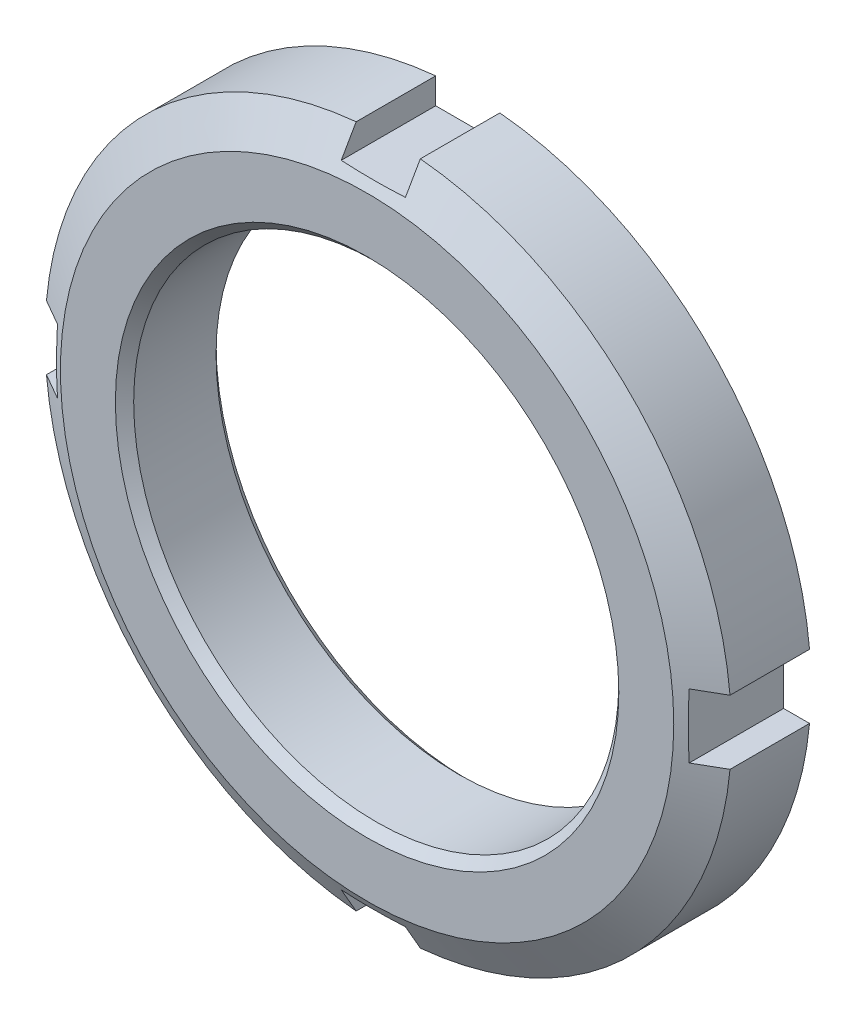
ISO-10303-21;
HEADER;
FILE_DESCRIPTION(('STEP AP214'),'2;1');
FILE_NAME('part.step','',(''),(''),'','','');
FILE_SCHEMA(('AUTOMOTIVE_DESIGN { 1 0 10303 214 1 1 1 1 }'));
ENDSEC;
DATA;
#1=APPLICATION_CONTEXT('core data for automotive mechanical design processes');
#2=APPLICATION_PROTOCOL_DEFINITION('international standard','automotive_design',2000,#1);
#3=PRODUCT_CONTEXT('',#1,'mechanical');
#4=PRODUCT('Part','Part','',(#3));
#5=PRODUCT_RELATED_PRODUCT_CATEGORY('part','',(#4));
#6=PRODUCT_DEFINITION_FORMATION('','',#4);
#7=PRODUCT_DEFINITION_CONTEXT('part definition',#1,'design');
#8=PRODUCT_DEFINITION('design','',#6,#7);
#9=PRODUCT_DEFINITION_SHAPE('','',#8);
#10=(LENGTH_UNIT() NAMED_UNIT(*) SI_UNIT(.MILLI.,.METRE.));
#11=(NAMED_UNIT(*) PLANE_ANGLE_UNIT() SI_UNIT($,.RADIAN.));
#12=(NAMED_UNIT(*) SI_UNIT($,.STERADIAN.) SOLID_ANGLE_UNIT());
#13=UNCERTAINTY_MEASURE_WITH_UNIT(LENGTH_MEASURE(1.E-05),#10,'distance_accuracy_value','');
#14=(GEOMETRIC_REPRESENTATION_CONTEXT(3) GLOBAL_UNCERTAINTY_ASSIGNED_CONTEXT((#13)) GLOBAL_UNIT_ASSIGNED_CONTEXT((#10,
#11,#12)) REPRESENTATION_CONTEXT('',''));
#15=CARTESIAN_POINT('',(0.,0.,0.));
#16=DIRECTION('',(0.,0.,1.));
#17=DIRECTION('',(1.,0.,0.));
#18=AXIS2_PLACEMENT_3D('',#15,#16,#17);
#19=CARTESIAN_POINT('',(0.,0.,9.84335512405345));
#20=DIRECTION('',(0.,0.,-1.));
#21=DIRECTION('',(-1.,0.,0.));
#22=AXIS2_PLACEMENT_3D('',#19,#20,#21);
#23=CONICAL_SURFACE('',#22,35.50285,1.0471975511966);
#24=CARTESIAN_POINT('',(3.5052,-34.5059,10.3164204706803));
#25=CARTESIAN_POINT('',(3.50519999999999,-35.8670881211337,9.53456180075329));
#26=CARTESIAN_POINT('',(3.5052,-37.3389352093763,8.68851024810689));
#27=(BOUNDED_CURVE() B_SPLINE_CURVE(2,(#24,#25,#26),.UNSPECIFIED.,.F.,
.F.) B_SPLINE_CURVE_WITH_KNOTS((3,3),(0.,0.326744246460528),
.UNSPECIFIED.) CURVE() GEOMETRIC_REPRESENTATION_ITEM() RATIONAL_B_SPLINE_CURVE((1.,
1.00077101555083,1.)) REPRESENTATION_ITEM(''));
#28=CARTESIAN_POINT('',(3.5052,-34.5059,10.3164204706803));
#29=VERTEX_POINT('',#28);
#30=CARTESIAN_POINT('',(3.5052,-37.3389352093763,8.6885102481069));
#31=VERTEX_POINT('',#30);
#32=EDGE_CURVE('E311',#29,#31,#27,.T.);
#33=ORIENTED_EDGE('',*,*,#32,.T.);
#34=CARTESIAN_POINT('',(0.,0.,8.6885102481069));
#35=DIRECTION('',(0.,0.,-1.));
#36=DIRECTION('',(-1.,0.,0.));
#37=AXIS2_PLACEMENT_3D('',#34,#35,#36);
#38=CIRCLE('',#37,37.5031);
#39=CARTESIAN_POINT('',(37.3389352093763,-3.5052,8.6885102481069));
#40=VERTEX_POINT('',#39);
#41=EDGE_CURVE('E391',#40,#31,#38,.T.);
#42=ORIENTED_EDGE('',*,*,#41,.F.);
#43=CARTESIAN_POINT('',(37.3389352093763,-3.5052,8.68851024810689));
#44=CARTESIAN_POINT('',(35.8670881208955,-3.50520000000001,9.53456180089019));
#45=CARTESIAN_POINT('',(34.5059,-3.5052,10.3164204706803));
#46=(BOUNDED_CURVE() B_SPLINE_CURVE(2,(#43,#44,#45),.UNSPECIFIED.,.F.,
.F.) B_SPLINE_CURVE_WITH_KNOTS((3,3),(0.,0.326744246460527),
.UNSPECIFIED.) CURVE() GEOMETRIC_REPRESENTATION_ITEM() RATIONAL_B_SPLINE_CURVE((1.,
1.00077101558435,1.)) REPRESENTATION_ITEM(''));
#47=CARTESIAN_POINT('',(34.5059,-3.5052,10.3164204706803));
#48=VERTEX_POINT('',#47);
#49=EDGE_CURVE('E324',#40,#48,#46,.T.);
#50=ORIENTED_EDGE('',*,*,#49,.T.);
#51=CARTESIAN_POINT('',(34.5059,-3.50520000000001,10.3164204706803));
#52=CARTESIAN_POINT('',(34.5059,-1.74810189513619,10.418944474922));
#53=CARTESIAN_POINT('',(34.5059,0.,10.418944474922));
#54=(BOUNDED_CURVE() B_SPLINE_CURVE(2,(#51,#52,#53),.UNSPECIFIED.,.F.,
.F.) B_SPLINE_CURVE_WITH_KNOTS((3,3),(1.11192937058732,1.47925581767771),
.UNSPECIFIED.) CURVE() GEOMETRIC_REPRESENTATION_ITEM() RATIONAL_B_SPLINE_CURVE((1.04075225629574,
1.04343025395657,1.04343025395657)) REPRESENTATION_ITEM(''));
#55=CARTESIAN_POINT('',(34.5059,0.,10.418944474922));
#56=VERTEX_POINT('',#55);
#57=EDGE_CURVE('E344',#48,#56,#54,.T.);
#58=ORIENTED_EDGE('',*,*,#57,.T.);
#59=DIRECTION('',(-0.866025403784439,0.,0.5));
#60=VECTOR('',#59,1.);
#61=CARTESIAN_POINT('',(35.50285,0.,9.84335512405344));
#62=LINE('',#61,#60);
#63=CARTESIAN_POINT('',(33.5026,0.,10.9982));
#64=VERTEX_POINT('',#63);
#65=EDGE_CURVE('E11',#56,#64,#62,.T.);
#66=ORIENTED_EDGE('',*,*,#65,.T.);
#67=CARTESIAN_POINT('',(0.,0.,10.9982));
#68=DIRECTION('',(0.,0.,-1.));
#69=DIRECTION('',(-1.,0.,0.));
#70=AXIS2_PLACEMENT_3D('',#67,#68,#69);
#71=CIRCLE('',#70,33.5026);
#72=EDGE_CURVE('E318',#64,#64,#71,.T.);
#73=ORIENTED_EDGE('',*,*,#72,.T.);
#74=ORIENTED_EDGE('',*,*,#65,.F.);
#75=CARTESIAN_POINT('',(34.5059,0.,10.418944474922));
#76=CARTESIAN_POINT('',(34.5059,1.74810189513618,10.418944474922));
#77=CARTESIAN_POINT('',(34.5059,3.50519999999999,10.3164204706803));
#78=(BOUNDED_CURVE() B_SPLINE_CURVE(2,(#75,#76,#77),.UNSPECIFIED.,.F.,
.F.) B_SPLINE_CURVE_WITH_KNOTS((3,3),(1.47925581767771,1.84658226476809),
.UNSPECIFIED.) CURVE() GEOMETRIC_REPRESENTATION_ITEM() RATIONAL_B_SPLINE_CURVE((1.04343025395657,
1.04343025395657,1.04075225629574)) REPRESENTATION_ITEM(''));
#79=CARTESIAN_POINT('',(34.5059,3.5052,10.3164204706803));
#80=VERTEX_POINT('',#79);
#81=EDGE_CURVE('E302',#56,#80,#78,.T.);
#82=ORIENTED_EDGE('',*,*,#81,.T.);
#83=CARTESIAN_POINT('',(34.5059,3.5052,10.3164204706803));
#84=CARTESIAN_POINT('',(35.8670881208966,3.50519999999999,9.53456180088953));
#85=CARTESIAN_POINT('',(37.3389352093763,3.5052,8.68851024810689));
#86=(BOUNDED_CURVE() B_SPLINE_CURVE(2,(#83,#84,#85),.UNSPECIFIED.,.F.,
.F.) B_SPLINE_CURVE_WITH_KNOTS((3,3),(0.,0.326744246460528),
.UNSPECIFIED.) CURVE() GEOMETRIC_REPRESENTATION_ITEM() RATIONAL_B_SPLINE_CURVE((1.,
1.00077101552891,1.)) REPRESENTATION_ITEM(''));
#87=CARTESIAN_POINT('',(37.3389352093763,3.5052,8.6885102481069));
#88=VERTEX_POINT('',#87);
#89=EDGE_CURVE('E287',#80,#88,#86,.T.);
#90=ORIENTED_EDGE('',*,*,#89,.T.);
#91=CARTESIAN_POINT('',(0.,0.,8.6885102481069));
#92=DIRECTION('',(0.,0.,-1.));
#93=DIRECTION('',(-1.,0.,0.));
#94=AXIS2_PLACEMENT_3D('',#91,#92,#93);
#95=CIRCLE('',#94,37.5031);
#96=CARTESIAN_POINT('',(3.5052,37.3389352093763,8.6885102481069));
#97=VERTEX_POINT('',#96);
#98=EDGE_CURVE('E301',#97,#88,#95,.T.);
#99=ORIENTED_EDGE('',*,*,#98,.F.);
#100=CARTESIAN_POINT('',(3.5052,37.3389352093763,8.68851024810689));
#101=CARTESIAN_POINT('',(3.5052,35.8670881216722,9.53456180044374));
#102=CARTESIAN_POINT('',(3.5052,34.5059,10.3164204706803));
#103=(BOUNDED_CURVE() B_SPLINE_CURVE(2,(#100,#101,#102),.UNSPECIFIED.,.F.,
.F.) B_SPLINE_CURVE_WITH_KNOTS((3,3),(0.,0.321227374186503),
.UNSPECIFIED.) CURVE() GEOMETRIC_REPRESENTATION_ITEM() RATIONAL_B_SPLINE_CURVE((1.,
1.00111314609381,1.00068385085712)) REPRESENTATION_ITEM(''));
#104=CARTESIAN_POINT('',(3.5052,34.5059,10.3164204706803));
#105=VERTEX_POINT('',#104);
#106=EDGE_CURVE('E372',#97,#105,#103,.T.);
#107=ORIENTED_EDGE('',*,*,#106,.T.);
#108=CARTESIAN_POINT('',(3.5052,34.5059,10.3164204706803));
#109=CARTESIAN_POINT('',(0.,34.5059,10.5209435639973));
#110=CARTESIAN_POINT('',(-3.5052,34.5059,10.3164204706803));
#111=(BOUNDED_CURVE() B_SPLINE_CURVE(2,(#108,#109,#110),.UNSPECIFIED.,.F.,
.F.) B_SPLINE_CURVE_WITH_KNOTS((3,3),(1.11192937058732,1.8465822647681),
.UNSPECIFIED.) CURVE() GEOMETRIC_REPRESENTATION_ITEM() RATIONAL_B_SPLINE_CURVE((1.04075225629574,
1.0461082516174,1.04075225629574)) REPRESENTATION_ITEM(''));
#112=CARTESIAN_POINT('',(-3.5052,34.5059,10.3164204706803));
#113=VERTEX_POINT('',#112);
#114=EDGE_CURVE('E28',#105,#113,#111,.T.);
#115=ORIENTED_EDGE('',*,*,#114,.T.);
#116=CARTESIAN_POINT('',(-3.5052,34.5059,10.3164204706803));
#117=CARTESIAN_POINT('',(-3.5052,35.8670881216666,9.53456180044692));
#118=CARTESIAN_POINT('',(-3.5052,37.3389352093763,8.68851024810689));
#119=(BOUNDED_CURVE() B_SPLINE_CURVE(2,(#116,#117,#118),.UNSPECIFIED.,.F.,
.F.) B_SPLINE_CURVE_WITH_KNOTS((3,3),(0.142418133400754,0.463645507587578),
.UNSPECIFIED.) CURVE() GEOMETRIC_REPRESENTATION_ITEM() RATIONAL_B_SPLINE_CURVE((1.00068385086096,
1.00111314610006,1.)) REPRESENTATION_ITEM(''));
#120=CARTESIAN_POINT('',(-3.5052,37.3389352093763,8.6885102481069));
#121=VERTEX_POINT('',#120);
#122=EDGE_CURVE('E373',#113,#121,#119,.T.);
#123=ORIENTED_EDGE('',*,*,#122,.T.);
#124=CARTESIAN_POINT('',(0.,0.,8.6885102481069));
#125=DIRECTION('',(0.,0.,-1.));
#126=DIRECTION('',(-1.,0.,0.));
#127=AXIS2_PLACEMENT_3D('',#124,#125,#126);
#128=CIRCLE('',#127,37.5031);
#129=CARTESIAN_POINT('',(-37.3389352093763,3.5052,8.6885102481069));
#130=VERTEX_POINT('',#129);
#131=EDGE_CURVE('E303',#130,#121,#128,.T.);
#132=ORIENTED_EDGE('',*,*,#131,.F.);
#133=CARTESIAN_POINT('',(-37.3389352093763,3.5052,8.68851024810689));
#134=CARTESIAN_POINT('',(-35.867088120777,3.50519999999999,9.5345618009583));
#135=CARTESIAN_POINT('',(-34.5059,3.5052,10.3164204706803));
#136=(BOUNDED_CURVE() B_SPLINE_CURVE(2,(#133,#134,#135),.UNSPECIFIED.,.F.,
.F.) B_SPLINE_CURVE_WITH_KNOTS((3,3),(0.,0.326744246460527),
.UNSPECIFIED.) CURVE() GEOMETRIC_REPRESENTATION_ITEM() RATIONAL_B_SPLINE_CURVE((1.,
1.00077101553309,1.)) REPRESENTATION_ITEM(''));
#137=CARTESIAN_POINT('',(-34.5059,3.5052,10.3164204706803));
#138=VERTEX_POINT('',#137);
#139=EDGE_CURVE('E245',#130,#138,#136,.T.);
#140=ORIENTED_EDGE('',*,*,#139,.T.);
#141=CARTESIAN_POINT('',(-34.5059,3.50519999999999,10.3164204706803));
#142=CARTESIAN_POINT('',(-34.5059,0.,10.5209435639973));
#143=CARTESIAN_POINT('',(-34.5059,-3.50520000000001,10.3164204706803));
#144=(BOUNDED_CURVE() B_SPLINE_CURVE(2,(#141,#142,#143),.UNSPECIFIED.,.F.,
.F.) B_SPLINE_CURVE_WITH_KNOTS((3,3),(1.11192937058733,1.8465822647681),
.UNSPECIFIED.) CURVE() GEOMETRIC_REPRESENTATION_ITEM() RATIONAL_B_SPLINE_CURVE((1.04075225629574,
1.0461082516174,1.04075225629574)) REPRESENTATION_ITEM(''));
#145=CARTESIAN_POINT('',(-34.5059,-3.5052,10.3164204706803));
#146=VERTEX_POINT('',#145);
#147=EDGE_CURVE('E293',#138,#146,#144,.T.);
#148=ORIENTED_EDGE('',*,*,#147,.T.);
#149=CARTESIAN_POINT('',(-34.5059,-3.5052,10.3164204706803));
#150=CARTESIAN_POINT('',(-35.8670881207781,-3.50520000000001,9.53456180095765));
#151=CARTESIAN_POINT('',(-37.3389352093763,-3.5052,8.68851024810689));
#152=(BOUNDED_CURVE() B_SPLINE_CURVE(2,(#149,#150,#151),.UNSPECIFIED.,.F.,
.F.) B_SPLINE_CURVE_WITH_KNOTS((3,3),(0.,0.326744246460528),
.UNSPECIFIED.) CURVE() GEOMETRIC_REPRESENTATION_ITEM() RATIONAL_B_SPLINE_CURVE((1.,
1.00077101557139,1.)) REPRESENTATION_ITEM(''));
#153=CARTESIAN_POINT('',(-37.3389352093763,-3.5052,8.6885102481069));
#154=VERTEX_POINT('',#153);
#155=EDGE_CURVE('E229',#146,#154,#152,.T.);
#156=ORIENTED_EDGE('',*,*,#155,.T.);
#157=CARTESIAN_POINT('',(0.,0.,8.6885102481069));
#158=DIRECTION('',(0.,0.,-1.));
#159=DIRECTION('',(-1.,0.,0.));
#160=AXIS2_PLACEMENT_3D('',#157,#158,#159);
#161=CIRCLE('',#160,37.5031);
#162=CARTESIAN_POINT('',(-3.5052,-37.3389352093763,8.6885102481069));
#163=VERTEX_POINT('',#162);
#164=EDGE_CURVE('E341',#163,#154,#161,.T.);
#165=ORIENTED_EDGE('',*,*,#164,.F.);
#166=CARTESIAN_POINT('',(-3.5052,-37.3389352093763,8.68851024810689));
#167=CARTESIAN_POINT('',(-3.5052,-35.8670881211326,9.53456180075394));
#168=CARTESIAN_POINT('',(-3.5052,-34.5059,10.3164204706803));
#169=(BOUNDED_CURVE() B_SPLINE_CURVE(2,(#166,#167,#168),.UNSPECIFIED.,.F.,
.F.) B_SPLINE_CURVE_WITH_KNOTS((3,3),(0.,0.326744246460527),
.UNSPECIFIED.) CURVE() GEOMETRIC_REPRESENTATION_ITEM() RATIONAL_B_SPLINE_CURVE((1.,
1.00077101555915,1.)) REPRESENTATION_ITEM(''));
#170=CARTESIAN_POINT('',(-3.5052,-34.5059,10.3164204706803));
#171=VERTEX_POINT('',#170);
#172=EDGE_CURVE('E328',#163,#171,#169,.T.);
#173=ORIENTED_EDGE('',*,*,#172,.T.);
#174=CARTESIAN_POINT('',(-3.5052,-34.5059,10.3164204706803));
#175=CARTESIAN_POINT('',(0.,-34.5059,10.5209435639973));
#176=CARTESIAN_POINT('',(3.5052,-34.5059,10.3164204706803));
#177=(BOUNDED_CURVE() B_SPLINE_CURVE(2,(#174,#175,#176),.UNSPECIFIED.,.F.,
.F.) B_SPLINE_CURVE_WITH_KNOTS((3,3),(1.11192937058732,1.84658226476809),
.UNSPECIFIED.) CURVE() GEOMETRIC_REPRESENTATION_ITEM() RATIONAL_B_SPLINE_CURVE((1.04075225629574,
1.0461082516174,1.04075225629574)) REPRESENTATION_ITEM(''));
#178=EDGE_CURVE('E460',#171,#29,#177,.T.);
#179=ORIENTED_EDGE('',*,*,#178,.T.);
#180=EDGE_LOOP('',(#33,#42,#50,#58,#66,#73,#74,#82,#90,#99,#107,#115,#123,#132,#140,#148,#156,
#165,#173,#179));
#181=FACE_BOUND('',#180,.T.);
#182=ADVANCED_FACE('F17',(#181),#23,.T.);
#183=CARTESIAN_POINT('',(3.5052,34.5059,0.));
#184=DIRECTION('',(0.,-1.,0.));
#185=DIRECTION('',(0.,0.,-1.));
#186=AXIS2_PLACEMENT_3D('',#183,#184,#185);
#187=PLANE('',#186);
#188=ORIENTED_EDGE('',*,*,#114,.F.);
#189=DIRECTION('',(0.,0.,1.));
#190=VECTOR('',#189,1.);
#191=CARTESIAN_POINT('',(3.5052,34.5059,0.));
#192=LINE('',#191,#190);
#193=CARTESIAN_POINT('',(3.5052,34.5059,0.));
#194=VERTEX_POINT('',#193);
#195=EDGE_CURVE('E392',#194,#105,#192,.T.);
#196=ORIENTED_EDGE('',*,*,#195,.F.);
#197=DIRECTION('',(1.,0.,0.));
#198=VECTOR('',#197,1.);
#199=CARTESIAN_POINT('',(-14.248175,34.5059,0.));
#200=LINE('',#199,#198);
#201=CARTESIAN_POINT('',(-3.5052,34.5059,0.));
#202=VERTEX_POINT('',#201);
#203=EDGE_CURVE('E282',#202,#194,#200,.T.);
#204=ORIENTED_EDGE('',*,*,#203,.F.);
#205=DIRECTION('',(0.,0.,1.));
#206=VECTOR('',#205,1.);
#207=CARTESIAN_POINT('',(-3.5052,34.5059,0.));
#208=LINE('',#207,#206);
#209=EDGE_CURVE('E369',#202,#113,#208,.T.);
#210=ORIENTED_EDGE('',*,*,#209,.T.);
#211=EDGE_LOOP('',(#188,#196,#204,#210));
#212=FACE_BOUND('',#211,.T.);
#213=ADVANCED_FACE('F530',(#212),#187,.F.);
#214=CARTESIAN_POINT('',(3.5052,37.5031,0.));
#215=DIRECTION('',(1.,0.,0.));
#216=DIRECTION('',(0.,-1.,0.));
#217=AXIS2_PLACEMENT_3D('',#214,#215,#216);
#218=PLANE('',#217);
#219=ORIENTED_EDGE('',*,*,#106,.F.);
#220=DIRECTION('',(0.,0.,1.));
#221=VECTOR('',#220,1.);
#222=CARTESIAN_POINT('',(3.5052,37.3389352093763,4.34425512405345));
#223=LINE('',#222,#221);
#224=CARTESIAN_POINT('',(3.5052,37.3389352093763,0.));
#225=VERTEX_POINT('',#224);
#226=EDGE_CURVE('E294',#225,#97,#223,.T.);
#227=ORIENTED_EDGE('',*,*,#226,.F.);
#228=DIRECTION('',(0.,1.,0.));
#229=VECTOR('',#228,1.);
#230=CARTESIAN_POINT('',(3.5052,18.75155,0.));
#231=LINE('',#230,#229);
#232=EDGE_CURVE('E286',#194,#225,#231,.T.);
#233=ORIENTED_EDGE('',*,*,#232,.F.);
#234=ORIENTED_EDGE('',*,*,#195,.T.);
#235=EDGE_LOOP('',(#219,#227,#233,#234));
#236=FACE_BOUND('',#235,.T.);
#237=ADVANCED_FACE('F536',(#236),#218,.F.);
#238=CARTESIAN_POINT('',(-3.5052,34.5059,0.));
#239=DIRECTION('',(-1.,0.,0.));
#240=DIRECTION('',(0.,1.,0.));
#241=AXIS2_PLACEMENT_3D('',#238,#239,#240);
#242=PLANE('',#241);
#243=ORIENTED_EDGE('',*,*,#122,.F.);
#244=ORIENTED_EDGE('',*,*,#209,.F.);
#245=DIRECTION('',(0.,-1.,0.));
#246=VECTOR('',#245,1.);
#247=CARTESIAN_POINT('',(-3.5052,17.25295,0.));
#248=LINE('',#247,#246);
#249=CARTESIAN_POINT('',(-3.5052,37.3389352093763,0.));
#250=VERTEX_POINT('',#249);
#251=EDGE_CURVE('E237',#250,#202,#248,.T.);
#252=ORIENTED_EDGE('',*,*,#251,.F.);
#253=DIRECTION('',(0.,0.,-1.));
#254=VECTOR('',#253,1.);
#255=CARTESIAN_POINT('',(-3.5052,37.3389352093763,4.34425512405345));
#256=LINE('',#255,#254);
#257=EDGE_CURVE('E307',#121,#250,#256,.T.);
#258=ORIENTED_EDGE('',*,*,#257,.F.);
#259=EDGE_LOOP('',(#243,#244,#252,#258));
#260=FACE_BOUND('',#259,.T.);
#261=ADVANCED_FACE('F540',(#260),#242,.F.);
#262=CARTESIAN_POINT('',(0.,0.,4.34425512405345));
#263=DIRECTION('',(0.,0.,-1.));
#264=DIRECTION('',(-1.,0.,0.));
#265=AXIS2_PLACEMENT_3D('',#262,#263,#264);
#266=CYLINDRICAL_SURFACE('',#265,37.5031);
#267=DIRECTION('',(0.,0.,-1.));
#268=VECTOR('',#267,1.);
#269=CARTESIAN_POINT('',(3.5052,-37.3389352093763,4.34425512405345));
#270=LINE('',#269,#268);
#271=CARTESIAN_POINT('',(3.5052,-37.3389352093763,0.));
#272=VERTEX_POINT('',#271);
#273=EDGE_CURVE('E335',#31,#272,#270,.T.);
#274=ORIENTED_EDGE('',*,*,#273,.T.);
#275=CARTESIAN_POINT('',(0.,0.,0.));
#276=DIRECTION('',(0.,0.,-1.));
#277=DIRECTION('',(-1.,0.,0.));
#278=AXIS2_PLACEMENT_3D('',#275,#276,#277);
#279=CIRCLE('',#278,37.5031);
#280=CARTESIAN_POINT('',(37.3389352093763,-3.5052,0.));
#281=VERTEX_POINT('',#280);
#282=EDGE_CURVE('E267',#281,#272,#279,.T.);
#283=ORIENTED_EDGE('',*,*,#282,.F.);
#284=DIRECTION('',(0.,0.,1.));
#285=VECTOR('',#284,1.);
#286=CARTESIAN_POINT('',(37.3389352093763,-3.5052,4.34425512405344));
#287=LINE('',#286,#285);
#288=EDGE_CURVE('E21',#281,#40,#287,.T.);
#289=ORIENTED_EDGE('',*,*,#288,.T.);
#290=ORIENTED_EDGE('',*,*,#41,.T.);
#291=EDGE_LOOP('',(#274,#283,#289,#290));
#292=FACE_BOUND('',#291,.T.);
#293=ADVANCED_FACE('F513',(#292),#266,.T.);
#294=CARTESIAN_POINT('',(0.,0.,4.34425512405345));
#295=DIRECTION('',(0.,0.,-1.));
#296=DIRECTION('',(-1.,0.,0.));
#297=AXIS2_PLACEMENT_3D('',#294,#295,#296);
#298=CYLINDRICAL_SURFACE('',#297,37.5031);
#299=DIRECTION('',(0.,0.,1.));
#300=VECTOR('',#299,1.);
#301=CARTESIAN_POINT('',(-3.5052,-37.3389352093763,4.34425512405345));
#302=LINE('',#301,#300);
#303=CARTESIAN_POINT('',(-3.5052,-37.3389352093763,0.));
#304=VERTEX_POINT('',#303);
#305=EDGE_CURVE('E334',#304,#163,#302,.T.);
#306=ORIENTED_EDGE('',*,*,#305,.T.);
#307=ORIENTED_EDGE('',*,*,#164,.T.);
#308=DIRECTION('',(0.,0.,-1.));
#309=VECTOR('',#308,1.);
#310=CARTESIAN_POINT('',(-37.3389352093763,-3.5052,4.34425512405346));
#311=LINE('',#310,#309);
#312=CARTESIAN_POINT('',(-37.3389352093763,-3.5052,0.));
#313=VERTEX_POINT('',#312);
#314=EDGE_CURVE('E251',#154,#313,#311,.T.);
#315=ORIENTED_EDGE('',*,*,#314,.T.);
#316=CARTESIAN_POINT('',(0.,0.,0.));
#317=DIRECTION('',(0.,0.,-1.));
#318=DIRECTION('',(-1.,0.,0.));
#319=AXIS2_PLACEMENT_3D('',#316,#317,#318);
#320=CIRCLE('',#319,37.5031);
#321=EDGE_CURVE('E256',#304,#313,#320,.T.);
#322=ORIENTED_EDGE('',*,*,#321,.F.);
#323=EDGE_LOOP('',(#306,#307,#315,#322));
#324=FACE_BOUND('',#323,.T.);
#325=ADVANCED_FACE('F544',(#324),#298,.T.);
#326=CARTESIAN_POINT('',(0.,0.,4.34425512405345));
#327=DIRECTION('',(0.,0.,-1.));
#328=DIRECTION('',(-1.,0.,0.));
#329=AXIS2_PLACEMENT_3D('',#326,#327,#328);
#330=CYLINDRICAL_SURFACE('',#329,37.5031);
#331=DIRECTION('',(0.,0.,1.));
#332=VECTOR('',#331,1.);
#333=CARTESIAN_POINT('',(-37.3389352093763,3.5052,4.34425512405346));
#334=LINE('',#333,#332);
#335=CARTESIAN_POINT('',(-37.3389352093763,3.5052,0.));
#336=VERTEX_POINT('',#335);
#337=EDGE_CURVE('E250',#336,#130,#334,.T.);
#338=ORIENTED_EDGE('',*,*,#337,.T.);
#339=ORIENTED_EDGE('',*,*,#131,.T.);
#340=ORIENTED_EDGE('',*,*,#257,.T.);
#341=CARTESIAN_POINT('',(0.,0.,0.));
#342=DIRECTION('',(0.,0.,-1.));
#343=DIRECTION('',(-1.,0.,0.));
#344=AXIS2_PLACEMENT_3D('',#341,#342,#343);
#345=CIRCLE('',#344,37.5031);
#346=EDGE_CURVE('E233',#336,#250,#345,.T.);
#347=ORIENTED_EDGE('',*,*,#346,.F.);
#348=EDGE_LOOP('',(#338,#339,#340,#347));
#349=FACE_BOUND('',#348,.T.);
#350=ADVANCED_FACE('F576',(#349),#330,.T.);
#351=CARTESIAN_POINT('',(0.,0.,4.34425512405345));
#352=DIRECTION('',(0.,0.,-1.));
#353=DIRECTION('',(-1.,0.,0.));
#354=AXIS2_PLACEMENT_3D('',#351,#352,#353);
#355=CYLINDRICAL_SURFACE('',#354,37.5031);
#356=DIRECTION('',(0.,0.,-1.));
#357=VECTOR('',#356,1.);
#358=CARTESIAN_POINT('',(37.3389352093763,3.5052,4.34425512405344));
#359=LINE('',#358,#357);
#360=CARTESIAN_POINT('',(37.3389352093763,3.5052,0.));
#361=VERTEX_POINT('',#360);
#362=EDGE_CURVE('E310',#88,#361,#359,.T.);
#363=ORIENTED_EDGE('',*,*,#362,.T.);
#364=CARTESIAN_POINT('',(0.,0.,0.));
#365=DIRECTION('',(0.,0.,-1.));
#366=DIRECTION('',(-1.,0.,0.));
#367=AXIS2_PLACEMENT_3D('',#364,#365,#366);
#368=CIRCLE('',#367,37.5031);
#369=EDGE_CURVE('E280',#225,#361,#368,.T.);
#370=ORIENTED_EDGE('',*,*,#369,.F.);
#371=ORIENTED_EDGE('',*,*,#226,.T.);
#372=ORIENTED_EDGE('',*,*,#98,.T.);
#373=EDGE_LOOP('',(#363,#370,#371,#372));
#374=FACE_BOUND('',#373,.T.);
#375=ADVANCED_FACE('F527',(#374),#355,.T.);
#376=CARTESIAN_POINT('',(34.5059,-3.5052,0.));
#377=DIRECTION('',(-1.,0.,0.));
#378=DIRECTION('',(0.,0.,1.));
#379=AXIS2_PLACEMENT_3D('',#376,#377,#378);
#380=PLANE('',#379);
#381=ORIENTED_EDGE('',*,*,#57,.F.);
#382=DIRECTION('',(0.,0.,1.));
#383=VECTOR('',#382,1.);
#384=CARTESIAN_POINT('',(34.5059,-3.5052,0.));
#385=LINE('',#384,#383);
#386=CARTESIAN_POINT('',(34.5059,-3.5052,0.));
#387=VERTEX_POINT('',#386);
#388=EDGE_CURVE('E154',#387,#48,#385,.T.);
#389=ORIENTED_EDGE('',*,*,#388,.F.);
#390=DIRECTION('',(0.,-1.,0.));
#391=VECTOR('',#390,1.);
#392=CARTESIAN_POINT('',(34.5059,-1.7526,0.));
#393=LINE('',#392,#391);
#394=CARTESIAN_POINT('',(34.5059,3.5052,0.));
#395=VERTEX_POINT('',#394);
#396=EDGE_CURVE('E279',#395,#387,#393,.T.);
#397=ORIENTED_EDGE('',*,*,#396,.F.);
#398=DIRECTION('',(0.,0.,1.));
#399=VECTOR('',#398,1.);
#400=CARTESIAN_POINT('',(34.5059,3.5052,0.));
#401=LINE('',#400,#399);
#402=EDGE_CURVE('E166',#395,#80,#401,.T.);
#403=ORIENTED_EDGE('',*,*,#402,.T.);
#404=ORIENTED_EDGE('',*,*,#81,.F.);
#405=EDGE_LOOP('',(#381,#389,#397,#403,#404));
#406=FACE_BOUND('',#405,.T.);
#407=ADVANCED_FACE('F517',(#406),#380,.F.);
#408=CARTESIAN_POINT('',(37.5031,-3.5052,0.));
#409=DIRECTION('',(0.,-1.,0.));
#410=DIRECTION('',(-1.,0.,0.));
#411=AXIS2_PLACEMENT_3D('',#408,#409,#410);
#412=PLANE('',#411);
#413=ORIENTED_EDGE('',*,*,#49,.F.);
#414=ORIENTED_EDGE('',*,*,#288,.F.);
#415=DIRECTION('',(1.,0.,0.));
#416=VECTOR('',#415,1.);
#417=CARTESIAN_POINT('',(2.750775,-3.5052,0.));
#418=LINE('',#417,#416);
#419=EDGE_CURVE('E275',#387,#281,#418,.T.);
#420=ORIENTED_EDGE('',*,*,#419,.F.);
#421=ORIENTED_EDGE('',*,*,#388,.T.);
#422=EDGE_LOOP('',(#413,#414,#420,#421));
#423=FACE_BOUND('',#422,.T.);
#424=ADVANCED_FACE('F514',(#423),#412,.F.);
#425=CARTESIAN_POINT('',(34.5059,3.5052,0.));
#426=DIRECTION('',(0.,1.,0.));
#427=DIRECTION('',(1.,0.,0.));
#428=AXIS2_PLACEMENT_3D('',#425,#426,#427);
#429=PLANE('',#428);
#430=ORIENTED_EDGE('',*,*,#89,.F.);
#431=ORIENTED_EDGE('',*,*,#402,.F.);
#432=DIRECTION('',(-1.,0.,0.));
#433=VECTOR('',#432,1.);
#434=CARTESIAN_POINT('',(1.252175,3.5052,0.));
#435=LINE('',#434,#433);
#436=EDGE_CURVE('E276',#361,#395,#435,.T.);
#437=ORIENTED_EDGE('',*,*,#436,.F.);
#438=ORIENTED_EDGE('',*,*,#362,.F.);
#439=EDGE_LOOP('',(#430,#431,#437,#438));
#440=FACE_BOUND('',#439,.T.);
#441=ADVANCED_FACE('F516',(#440),#429,.F.);
#442=CARTESIAN_POINT('',(-34.5059,3.5052,0.));
#443=DIRECTION('',(1.,0.,0.));
#444=DIRECTION('',(0.,1.,0.));
#445=AXIS2_PLACEMENT_3D('',#442,#443,#444);
#446=PLANE('',#445);
#447=ORIENTED_EDGE('',*,*,#147,.F.);
#448=DIRECTION('',(0.,0.,1.));
#449=VECTOR('',#448,1.);
#450=CARTESIAN_POINT('',(-34.5059,3.5052,0.));
#451=LINE('',#450,#449);
#452=CARTESIAN_POINT('',(-34.5059,3.5052,0.));
#453=VERTEX_POINT('',#452);
#454=EDGE_CURVE('E271',#453,#138,#451,.T.);
#455=ORIENTED_EDGE('',*,*,#454,.F.);
#456=DIRECTION('',(0.,1.,0.));
#457=VECTOR('',#456,1.);
#458=CARTESIAN_POINT('',(-34.5059,1.7526,0.));
#459=LINE('',#458,#457);
#460=CARTESIAN_POINT('',(-34.5059,-3.5052,0.));
#461=VERTEX_POINT('',#460);
#462=EDGE_CURVE('E403',#461,#453,#459,.T.);
#463=ORIENTED_EDGE('',*,*,#462,.F.);
#464=DIRECTION('',(0.,0.,1.));
#465=VECTOR('',#464,1.);
#466=CARTESIAN_POINT('',(-34.5059,-3.5052,0.));
#467=LINE('',#466,#465);
#468=EDGE_CURVE('E343',#461,#146,#467,.T.);
#469=ORIENTED_EDGE('',*,*,#468,.T.);
#470=EDGE_LOOP('',(#447,#455,#463,#469));
#471=FACE_BOUND('',#470,.T.);
#472=ADVANCED_FACE('F525',(#471),#446,.F.);
#473=CARTESIAN_POINT('',(-37.5031,3.5052,0.));
#474=DIRECTION('',(0.,1.,0.));
#475=DIRECTION('',(1.,0.,0.));
#476=AXIS2_PLACEMENT_3D('',#473,#474,#475);
#477=PLANE('',#476);
#478=ORIENTED_EDGE('',*,*,#139,.F.);
#479=ORIENTED_EDGE('',*,*,#337,.F.);
#480=DIRECTION('',(-1.,0.,0.));
#481=VECTOR('',#480,1.);
#482=CARTESIAN_POINT('',(-34.752325,3.5052,0.));
#483=LINE('',#482,#481);
#484=EDGE_CURVE('E238',#453,#336,#483,.T.);
#485=ORIENTED_EDGE('',*,*,#484,.F.);
#486=ORIENTED_EDGE('',*,*,#454,.T.);
#487=EDGE_LOOP('',(#478,#479,#485,#486));
#488=FACE_BOUND('',#487,.T.);
#489=ADVANCED_FACE('F553',(#488),#477,.F.);
#490=CARTESIAN_POINT('',(-34.5059,-3.5052,0.));
#491=DIRECTION('',(0.,-1.,0.));
#492=DIRECTION('',(0.,0.,-1.));
#493=AXIS2_PLACEMENT_3D('',#490,#491,#492);
#494=PLANE('',#493);
#495=ORIENTED_EDGE('',*,*,#155,.F.);
#496=ORIENTED_EDGE('',*,*,#468,.F.);
#497=DIRECTION('',(1.,0.,0.));
#498=VECTOR('',#497,1.);
#499=CARTESIAN_POINT('',(-33.253725,-3.5052,0.));
#500=LINE('',#499,#498);
#501=EDGE_CURVE('E260',#313,#461,#500,.T.);
#502=ORIENTED_EDGE('',*,*,#501,.F.);
#503=ORIENTED_EDGE('',*,*,#314,.F.);
#504=EDGE_LOOP('',(#495,#496,#502,#503));
#505=FACE_BOUND('',#504,.T.);
#506=ADVANCED_FACE('F551',(#505),#494,.F.);
#507=CARTESIAN_POINT('',(-3.5052,-34.5059,0.));
#508=DIRECTION('',(0.,1.,0.));
#509=DIRECTION('',(1.,0.,0.));
#510=AXIS2_PLACEMENT_3D('',#507,#508,#509);
#511=PLANE('',#510);
#512=ORIENTED_EDGE('',*,*,#178,.F.);
#513=DIRECTION('',(0.,0.,1.));
#514=VECTOR('',#513,1.);
#515=CARTESIAN_POINT('',(-3.5052,-34.5059,0.));
#516=LINE('',#515,#514);
#517=CARTESIAN_POINT('',(-3.5052,-34.5059,0.));
#518=VERTEX_POINT('',#517);
#519=EDGE_CURVE('E467',#518,#171,#516,.T.);
#520=ORIENTED_EDGE('',*,*,#519,.F.);
#521=DIRECTION('',(-1.,0.,0.));
#522=VECTOR('',#521,1.);
#523=CARTESIAN_POINT('',(-17.753375,-34.5059,0.));
#524=LINE('',#523,#522);
#525=CARTESIAN_POINT('',(3.5052,-34.5059,0.));
#526=VERTEX_POINT('',#525);
#527=EDGE_CURVE('E243',#526,#518,#524,.T.);
#528=ORIENTED_EDGE('',*,*,#527,.F.);
#529=DIRECTION('',(0.,0.,1.));
#530=VECTOR('',#529,1.);
#531=CARTESIAN_POINT('',(3.5052,-34.5059,0.));
#532=LINE('',#531,#530);
#533=EDGE_CURVE('E317',#526,#29,#532,.T.);
#534=ORIENTED_EDGE('',*,*,#533,.T.);
#535=EDGE_LOOP('',(#512,#520,#528,#534));
#536=FACE_BOUND('',#535,.T.);
#537=ADVANCED_FACE('F506',(#536),#511,.F.);
#538=CARTESIAN_POINT('',(-3.5052,-37.5031,0.));
#539=DIRECTION('',(-1.,0.,0.));
#540=DIRECTION('',(0.,0.,1.));
#541=AXIS2_PLACEMENT_3D('',#538,#539,#540);
#542=PLANE('',#541);
#543=ORIENTED_EDGE('',*,*,#172,.F.);
#544=ORIENTED_EDGE('',*,*,#305,.F.);
#545=DIRECTION('',(0.,-1.,0.));
#546=VECTOR('',#545,1.);
#547=CARTESIAN_POINT('',(-3.5052,-18.75155,0.));
#548=LINE('',#547,#546);
#549=EDGE_CURVE('E261',#518,#304,#548,.T.);
#550=ORIENTED_EDGE('',*,*,#549,.F.);
#551=ORIENTED_EDGE('',*,*,#519,.T.);
#552=EDGE_LOOP('',(#543,#544,#550,#551));
#553=FACE_BOUND('',#552,.T.);
#554=ADVANCED_FACE('F545',(#553),#542,.F.);
#555=CARTESIAN_POINT('',(3.5052,-34.5059,0.));
#556=DIRECTION('',(1.,0.,0.));
#557=DIRECTION('',(0.,1.,0.));
#558=AXIS2_PLACEMENT_3D('',#555,#556,#557);
#559=PLANE('',#558);
#560=ORIENTED_EDGE('',*,*,#32,.F.);
#561=ORIENTED_EDGE('',*,*,#533,.F.);
#562=DIRECTION('',(0.,1.,0.));
#563=VECTOR('',#562,1.);
#564=CARTESIAN_POINT('',(3.5052,-17.25295,0.));
#565=LINE('',#564,#563);
#566=EDGE_CURVE('E239',#272,#526,#565,.T.);
#567=ORIENTED_EDGE('',*,*,#566,.F.);
#568=ORIENTED_EDGE('',*,*,#273,.F.);
#569=EDGE_LOOP('',(#560,#561,#567,#568));
#570=FACE_BOUND('',#569,.T.);
#571=ADVANCED_FACE('F510',(#570),#559,.F.);
#572=CARTESIAN_POINT('',(-30.0013,0.,10.9982));
#573=DIRECTION('',(0.,0.,1.));
#574=DIRECTION('',(1.,0.,0.));
#575=AXIS2_PLACEMENT_3D('',#572,#573,#574);
#576=PLANE('',#575);
#577=CARTESIAN_POINT('',(0.,0.,10.9982));
#578=DIRECTION('',(0.,0.,1.));
#579=DIRECTION('',(1.,0.,0.));
#580=AXIS2_PLACEMENT_3D('',#577,#578,#579);
#581=CIRCLE('',#580,27.5);
#582=CARTESIAN_POINT('',(-27.5,0.,10.9982));
#583=VERTEX_POINT('',#582);
#584=EDGE_CURVE('E262',#583,#583,#581,.T.);
#585=ORIENTED_EDGE('',*,*,#584,.F.);
#586=EDGE_LOOP('',(#585));
#587=FACE_BOUND('',#586,.T.);
#588=ORIENTED_EDGE('',*,*,#72,.F.);
#589=EDGE_LOOP('',(#588));
#590=FACE_BOUND('',#589,.T.);
#591=ADVANCED_FACE('F570',(#587,#590),#576,.T.);
#592=CARTESIAN_POINT('',(0.,0.,10.4982));
#593=DIRECTION('',(0.,0.,1.));
#594=DIRECTION('',(1.,0.,0.));
#595=AXIS2_PLACEMENT_3D('',#592,#593,#594);
#596=CONICAL_SURFACE('',#595,27.,0.78539816339745);
#597=ORIENTED_EDGE('',*,*,#584,.T.);
#598=DIRECTION('',(0.707106781186549,0.,-0.707106781186546));
#599=VECTOR('',#598,1.);
#600=CARTESIAN_POINT('',(-27.,0.,10.4982));
#601=LINE('',#600,#599);
#602=CARTESIAN_POINT('',(-26.5,0.,9.9982));
#603=VERTEX_POINT('',#602);
#604=EDGE_CURVE('E266',#583,#603,#601,.T.);
#605=ORIENTED_EDGE('',*,*,#604,.T.);
#606=CARTESIAN_POINT('',(0.,0.,9.9982));
#607=DIRECTION('',(0.,0.,-1.));
#608=DIRECTION('',(1.,0.,0.));
#609=AXIS2_PLACEMENT_3D('',#606,#607,#608);
#610=CIRCLE('',#609,26.5);
#611=CARTESIAN_POINT('',(26.5,0.,9.9982));
#612=VERTEX_POINT('',#611);
#613=EDGE_CURVE('E377',#603,#612,#610,.T.);
#614=ORIENTED_EDGE('',*,*,#613,.T.);
#615=CARTESIAN_POINT('',(0.,0.,9.9982));
#616=DIRECTION('',(0.,0.,-1.));
#617=DIRECTION('',(1.,0.,0.));
#618=AXIS2_PLACEMENT_3D('',#615,#616,#617);
#619=CIRCLE('',#618,26.5);
#620=EDGE_CURVE('E244',#612,#603,#619,.T.);
#621=ORIENTED_EDGE('',*,*,#620,.T.);
#622=ORIENTED_EDGE('',*,*,#604,.F.);
#623=EDGE_LOOP('',(#597,#605,#614,#621,#622));
#624=FACE_BOUND('',#623,.T.);
#625=ADVANCED_FACE('F19',(#624),#596,.F.);
#626=CARTESIAN_POINT('',(-32.00155,0.,0.));
#627=DIRECTION('',(0.,0.,-1.));
#628=DIRECTION('',(-1.,0.,0.));
#629=AXIS2_PLACEMENT_3D('',#626,#627,#628);
#630=PLANE('',#629);
#631=CARTESIAN_POINT('',(0.,0.,0.));
#632=DIRECTION('',(0.,0.,-1.));
#633=DIRECTION('',(1.,0.,0.));
#634=AXIS2_PLACEMENT_3D('',#631,#632,#633);
#635=CIRCLE('',#634,27.5);
#636=CARTESIAN_POINT('',(-27.5,0.,0.));
#637=VERTEX_POINT('',#636);
#638=EDGE_CURVE('E215',#637,#637,#635,.T.);
#639=ORIENTED_EDGE('',*,*,#638,.F.);
#640=EDGE_LOOP('',(#639));
#641=FACE_BOUND('',#640,.T.);
#642=ORIENTED_EDGE('',*,*,#566,.T.);
#643=ORIENTED_EDGE('',*,*,#527,.T.);
#644=ORIENTED_EDGE('',*,*,#549,.T.);
#645=ORIENTED_EDGE('',*,*,#321,.T.);
#646=ORIENTED_EDGE('',*,*,#501,.T.);
#647=ORIENTED_EDGE('',*,*,#462,.T.);
#648=ORIENTED_EDGE('',*,*,#484,.T.);
#649=ORIENTED_EDGE('',*,*,#346,.T.);
#650=ORIENTED_EDGE('',*,*,#251,.T.);
#651=ORIENTED_EDGE('',*,*,#203,.T.);
#652=ORIENTED_EDGE('',*,*,#232,.T.);
#653=ORIENTED_EDGE('',*,*,#369,.T.);
#654=ORIENTED_EDGE('',*,*,#436,.T.);
#655=ORIENTED_EDGE('',*,*,#396,.T.);
#656=ORIENTED_EDGE('',*,*,#419,.T.);
#657=ORIENTED_EDGE('',*,*,#282,.T.);
#658=EDGE_LOOP('',(#642,#643,#644,#645,#646,#647,#648,#649,#650,#651,#652,#653,#654,#655,#656,#657));
#659=FACE_BOUND('',#658,.T.);
#660=ADVANCED_FACE('F557',(#641,#659),#630,.T.);
#661=CARTESIAN_POINT('',(0.,0.,5.4991));
#662=DIRECTION('',(0.,0.,-1.));
#663=DIRECTION('',(-1.,0.,0.));
#664=AXIS2_PLACEMENT_3D('',#661,#662,#663);
#665=CYLINDRICAL_SURFACE('',#664,26.5);
#666=CARTESIAN_POINT('',(0.,0.,1.));
#667=DIRECTION('',(0.,0.,1.));
#668=DIRECTION('',(1.,0.,0.));
#669=AXIS2_PLACEMENT_3D('',#666,#667,#668);
#670=CIRCLE('',#669,26.5);
#671=CARTESIAN_POINT('',(-26.5,0.,1.));
#672=VERTEX_POINT('',#671);
#673=CARTESIAN_POINT('',(26.5,0.,0.999999999999987));
#674=VERTEX_POINT('',#673);
#675=EDGE_CURVE('E213',#672,#674,#670,.T.);
#676=ORIENTED_EDGE('',*,*,#675,.F.);
#677=CARTESIAN_POINT('',(0.,0.,1.));
#678=DIRECTION('',(0.,0.,1.));
#679=DIRECTION('',(1.,0.,0.));
#680=AXIS2_PLACEMENT_3D('',#677,#678,#679);
#681=CIRCLE('',#680,26.5);
#682=EDGE_CURVE('E217',#674,#672,#681,.T.);
#683=ORIENTED_EDGE('',*,*,#682,.F.);
#684=DIRECTION('',(0.,0.,1.));
#685=VECTOR('',#684,1.);
#686=CARTESIAN_POINT('',(26.5,0.,5.4991));
#687=LINE('',#686,#685);
#688=EDGE_CURVE('E201',#674,#612,#687,.T.);
#689=ORIENTED_EDGE('',*,*,#688,.T.);
#690=ORIENTED_EDGE('',*,*,#613,.F.);
#691=ORIENTED_EDGE('',*,*,#620,.F.);
#692=ORIENTED_EDGE('',*,*,#688,.F.);
#693=EDGE_LOOP('',(#676,#683,#689,#690,#691,#692));
#694=FACE_BOUND('',#693,.T.);
#695=ADVANCED_FACE('F221',(#694),#665,.F.);
#696=CARTESIAN_POINT('',(0.,0.,0.499999999999994));
#697=DIRECTION('',(0.,0.,-1.));
#698=DIRECTION('',(1.,0.,0.));
#699=AXIS2_PLACEMENT_3D('',#696,#697,#698);
#700=CONICAL_SURFACE('',#699,27.,0.785398163397449);
#701=ORIENTED_EDGE('',*,*,#675,.T.);
#702=ORIENTED_EDGE('',*,*,#682,.T.);
#703=DIRECTION('',(-0.707106781186548,0.,-0.707106781186547));
#704=VECTOR('',#703,1.);
#705=CARTESIAN_POINT('',(-27.,0.,0.5));
#706=LINE('',#705,#704);
#707=EDGE_CURVE('E210',#672,#637,#706,.T.);
#708=ORIENTED_EDGE('',*,*,#707,.T.);
#709=ORIENTED_EDGE('',*,*,#638,.T.);
#710=ORIENTED_EDGE('',*,*,#707,.F.);
#711=EDGE_LOOP('',(#701,#702,#708,#709,#710));
#712=FACE_BOUND('',#711,.T.);
#713=ADVANCED_FACE('F212',(#712),#700,.F.);
#714=CLOSED_SHELL('',(#182,#213,#237,#261,#293,#325,#350,#375,#407,#424,#441,#472,#489,#506,
#537,#554,#571,#591,#625,#660,#695,#713));
#715=MANIFOLD_SOLID_BREP('B1',#714);
#716=ADVANCED_BREP_SHAPE_REPRESENTATION('',(#18,#715),#14);
#717=SHAPE_DEFINITION_REPRESENTATION(#9,#716);
ENDSEC;
END-ISO-10303-21;
